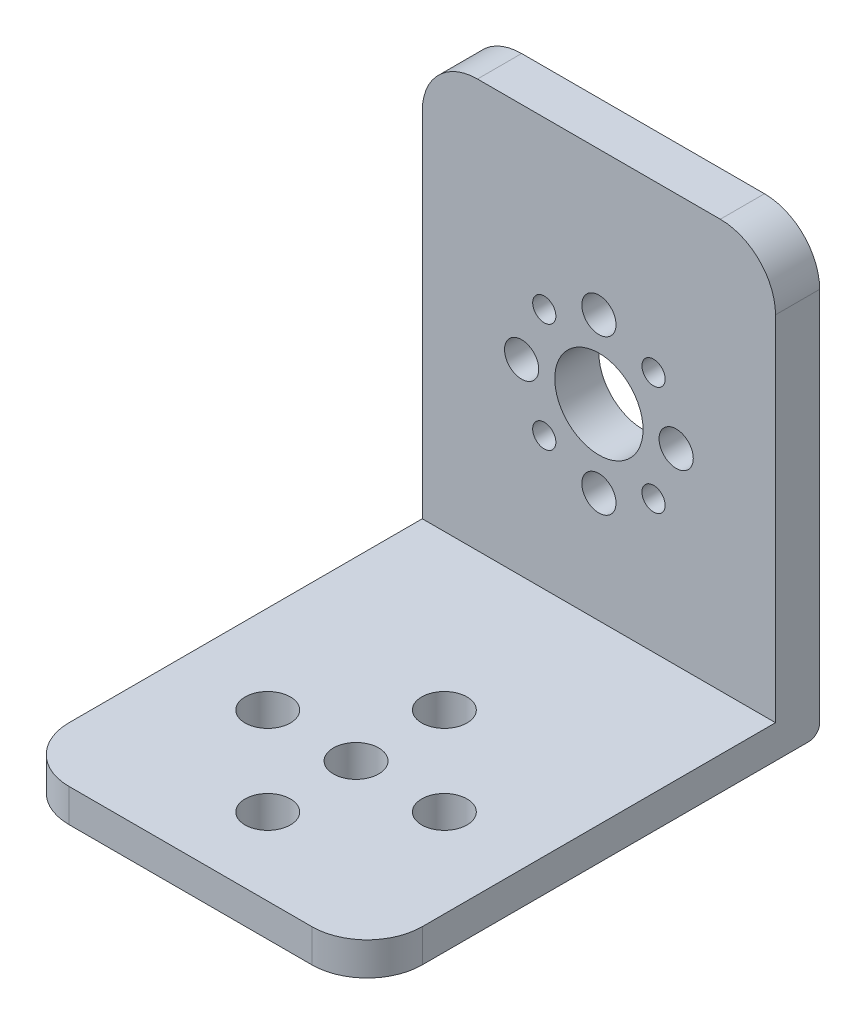
ISO-10303-21;
HEADER;
FILE_DESCRIPTION(('STEP AP214'),'2;1');
FILE_NAME('part.step','',(''),(''),'','','');
FILE_SCHEMA(('AUTOMOTIVE_DESIGN { 1 0 10303 214 1 1 1 1 }'));
ENDSEC;
DATA;
#1=APPLICATION_CONTEXT('core data for automotive mechanical design processes');
#2=APPLICATION_PROTOCOL_DEFINITION('international standard','automotive_design',2000,#1);
#3=PRODUCT_CONTEXT('',#1,'mechanical');
#4=PRODUCT('Part','Part','',(#3));
#5=PRODUCT_RELATED_PRODUCT_CATEGORY('part','',(#4));
#6=PRODUCT_DEFINITION_FORMATION('','',#4);
#7=PRODUCT_DEFINITION_CONTEXT('part definition',#1,'design');
#8=PRODUCT_DEFINITION('design','',#6,#7);
#9=PRODUCT_DEFINITION_SHAPE('','',#8);
#10=(LENGTH_UNIT() NAMED_UNIT(*) SI_UNIT(.MILLI.,.METRE.));
#11=(NAMED_UNIT(*) PLANE_ANGLE_UNIT() SI_UNIT($,.RADIAN.));
#12=(NAMED_UNIT(*) SI_UNIT($,.STERADIAN.) SOLID_ANGLE_UNIT());
#13=UNCERTAINTY_MEASURE_WITH_UNIT(LENGTH_MEASURE(1.E-05),#10,'distance_accuracy_value','');
#14=(GEOMETRIC_REPRESENTATION_CONTEXT(3) GLOBAL_UNCERTAINTY_ASSIGNED_CONTEXT((#13)) GLOBAL_UNIT_ASSIGNED_CONTEXT((#10,
#11,#12)) REPRESENTATION_CONTEXT('',''));
#15=CARTESIAN_POINT('',(0.,0.,0.));
#16=DIRECTION('',(0.,0.,1.));
#17=DIRECTION('',(1.,0.,0.));
#18=AXIS2_PLACEMENT_3D('',#15,#16,#17);
#19=CARTESIAN_POINT('',(16.,3.,-20.));
#20=DIRECTION('',(-1.,0.,0.));
#21=DIRECTION('',(0.,0.,1.));
#22=AXIS2_PLACEMENT_3D('',#19,#20,#21);
#23=PLANE('',#22);
#24=DIRECTION('',(0.,0.,-1.));
#25=VECTOR('',#24,1.);
#26=CARTESIAN_POINT('',(16.,0.,-20.));
#27=LINE('',#26,#25);
#28=CARTESIAN_POINT('',(16.,0.,15.));
#29=VERTEX_POINT('',#28);
#30=CARTESIAN_POINT('',(16.,0.,-20.));
#31=VERTEX_POINT('',#30);
#32=EDGE_CURVE('E258',#29,#31,#27,.T.);
#33=ORIENTED_EDGE('',*,*,#32,.T.);
#34=CARTESIAN_POINT('',(16.,1.,-20.));
#35=DIRECTION('',(-1.,0.,0.));
#36=DIRECTION('',(0.,0.,1.));
#37=AXIS2_PLACEMENT_3D('',#34,#35,#36);
#38=CIRCLE('',#37,1.);
#39=CARTESIAN_POINT('',(16.,1.,-21.));
#40=VERTEX_POINT('',#39);
#41=EDGE_CURVE('E11',#31,#40,#38,.F.);
#42=ORIENTED_EDGE('',*,*,#41,.T.);
#43=DIRECTION('',(0.,-1.,0.));
#44=VECTOR('',#43,1.);
#45=CARTESIAN_POINT('',(16.,35.,-21.));
#46=LINE('',#45,#44);
#47=CARTESIAN_POINT('',(16.,35.,-21.));
#48=VERTEX_POINT('',#47);
#49=EDGE_CURVE('E163',#48,#40,#46,.T.);
#50=ORIENTED_EDGE('',*,*,#49,.F.);
#51=DIRECTION('',(0.,0.,-1.));
#52=VECTOR('',#51,1.);
#53=CARTESIAN_POINT('',(16.,35.,-17.));
#54=LINE('',#53,#52);
#55=CARTESIAN_POINT('',(16.,35.,-17.));
#56=VERTEX_POINT('',#55);
#57=EDGE_CURVE('E284',#48,#56,#54,.F.);
#58=ORIENTED_EDGE('',*,*,#57,.T.);
#59=DIRECTION('',(0.,-1.,0.));
#60=VECTOR('',#59,1.);
#61=CARTESIAN_POINT('',(16.,40.,-17.));
#62=LINE('',#61,#60);
#63=CARTESIAN_POINT('',(16.,3.,-17.));
#64=VERTEX_POINT('',#63);
#65=EDGE_CURVE('E248',#56,#64,#62,.T.);
#66=ORIENTED_EDGE('',*,*,#65,.T.);
#67=DIRECTION('',(0.,0.,-1.));
#68=VECTOR('',#67,1.);
#69=CARTESIAN_POINT('',(16.,3.,-20.));
#70=LINE('',#69,#68);
#71=CARTESIAN_POINT('',(16.,3.,15.));
#72=VERTEX_POINT('',#71);
#73=EDGE_CURVE('E259',#72,#64,#70,.T.);
#74=ORIENTED_EDGE('',*,*,#73,.F.);
#75=DIRECTION('',(0.,-1.,0.));
#76=VECTOR('',#75,1.);
#77=CARTESIAN_POINT('',(16.,3.,15.));
#78=LINE('',#77,#76);
#79=EDGE_CURVE('E280',#72,#29,#78,.T.);
#80=ORIENTED_EDGE('',*,*,#79,.T.);
#81=EDGE_LOOP('',(#33,#42,#50,#58,#66,#74,#80));
#82=FACE_BOUND('',#81,.T.);
#83=ADVANCED_FACE('F39',(#82),#23,.F.);
#84=CARTESIAN_POINT('',(-16.,3.,-20.));
#85=DIRECTION('',(1.,0.,0.));
#86=DIRECTION('',(0.,0.,-1.));
#87=AXIS2_PLACEMENT_3D('',#84,#85,#86);
#88=PLANE('',#87);
#89=DIRECTION('',(0.,1.,0.));
#90=VECTOR('',#89,1.);
#91=CARTESIAN_POINT('',(-16.,0.,-21.));
#92=LINE('',#91,#90);
#93=CARTESIAN_POINT('',(-16.,1.,-21.));
#94=VERTEX_POINT('',#93);
#95=CARTESIAN_POINT('',(-16.,35.,-21.));
#96=VERTEX_POINT('',#95);
#97=EDGE_CURVE('E150',#94,#96,#92,.T.);
#98=ORIENTED_EDGE('',*,*,#97,.F.);
#99=CARTESIAN_POINT('',(-16.,1.,-20.));
#100=DIRECTION('',(1.,0.,0.));
#101=DIRECTION('',(0.,0.,-1.));
#102=AXIS2_PLACEMENT_3D('',#99,#100,#101);
#103=CIRCLE('',#102,1.);
#104=CARTESIAN_POINT('',(-16.,0.,-20.));
#105=VERTEX_POINT('',#104);
#106=EDGE_CURVE('E62',#94,#105,#103,.F.);
#107=ORIENTED_EDGE('',*,*,#106,.T.);
#108=DIRECTION('',(0.,0.,1.));
#109=VECTOR('',#108,1.);
#110=CARTESIAN_POINT('',(-16.,0.,-20.));
#111=LINE('',#110,#109);
#112=CARTESIAN_POINT('',(-16.,0.,15.));
#113=VERTEX_POINT('',#112);
#114=EDGE_CURVE('E272',#105,#113,#111,.T.);
#115=ORIENTED_EDGE('',*,*,#114,.T.);
#116=DIRECTION('',(0.,-1.,0.));
#117=VECTOR('',#116,1.);
#118=CARTESIAN_POINT('',(-16.,3.,15.));
#119=LINE('',#118,#117);
#120=CARTESIAN_POINT('',(-16.,3.,15.));
#121=VERTEX_POINT('',#120);
#122=EDGE_CURVE('E292',#113,#121,#119,.F.);
#123=ORIENTED_EDGE('',*,*,#122,.T.);
#124=DIRECTION('',(0.,0.,1.));
#125=VECTOR('',#124,1.);
#126=CARTESIAN_POINT('',(-16.,3.,-20.));
#127=LINE('',#126,#125);
#128=CARTESIAN_POINT('',(-16.,3.,-17.));
#129=VERTEX_POINT('',#128);
#130=EDGE_CURVE('E262',#129,#121,#127,.T.);
#131=ORIENTED_EDGE('',*,*,#130,.F.);
#132=DIRECTION('',(0.,-1.,0.));
#133=VECTOR('',#132,1.);
#134=CARTESIAN_POINT('',(-16.,40.,-17.));
#135=LINE('',#134,#133);
#136=CARTESIAN_POINT('',(-16.,35.,-17.));
#137=VERTEX_POINT('',#136);
#138=EDGE_CURVE('E255',#137,#129,#135,.T.);
#139=ORIENTED_EDGE('',*,*,#138,.F.);
#140=DIRECTION('',(0.,0.,1.));
#141=VECTOR('',#140,1.);
#142=CARTESIAN_POINT('',(-16.,35.,-20.));
#143=LINE('',#142,#141);
#144=EDGE_CURVE('E295',#137,#96,#143,.F.);
#145=ORIENTED_EDGE('',*,*,#144,.T.);
#146=EDGE_LOOP('',(#98,#107,#115,#123,#131,#139,#145));
#147=FACE_BOUND('',#146,.T.);
#148=ADVANCED_FACE('F327',(#147),#88,.F.);
#149=CARTESIAN_POINT('',(-16.,3.,20.));
#150=DIRECTION('',(0.,0.,-1.));
#151=DIRECTION('',(-1.,0.,0.));
#152=AXIS2_PLACEMENT_3D('',#149,#150,#151);
#153=PLANE('',#152);
#154=DIRECTION('',(1.,0.,0.));
#155=VECTOR('',#154,1.);
#156=CARTESIAN_POINT('',(-16.,3.,20.));
#157=LINE('',#156,#155);
#158=CARTESIAN_POINT('',(-11.,3.,20.));
#159=VERTEX_POINT('',#158);
#160=CARTESIAN_POINT('',(11.,3.,20.));
#161=VERTEX_POINT('',#160);
#162=EDGE_CURVE('E134',#159,#161,#157,.T.);
#163=ORIENTED_EDGE('',*,*,#162,.F.);
#164=DIRECTION('',(0.,-1.,0.));
#165=VECTOR('',#164,1.);
#166=CARTESIAN_POINT('',(-11.,3.,20.));
#167=LINE('',#166,#165);
#168=CARTESIAN_POINT('',(-11.,0.,20.));
#169=VERTEX_POINT('',#168);
#170=EDGE_CURVE('E301',#159,#169,#167,.T.);
#171=ORIENTED_EDGE('',*,*,#170,.T.);
#172=DIRECTION('',(1.,0.,0.));
#173=VECTOR('',#172,1.);
#174=CARTESIAN_POINT('',(-16.,0.,20.));
#175=LINE('',#174,#173);
#176=CARTESIAN_POINT('',(11.,0.,20.));
#177=VERTEX_POINT('',#176);
#178=EDGE_CURVE('E263',#169,#177,#175,.T.);
#179=ORIENTED_EDGE('',*,*,#178,.T.);
#180=DIRECTION('',(0.,-1.,0.));
#181=VECTOR('',#180,1.);
#182=CARTESIAN_POINT('',(11.,3.,20.));
#183=LINE('',#182,#181);
#184=EDGE_CURVE('E298',#177,#161,#183,.F.);
#185=ORIENTED_EDGE('',*,*,#184,.T.);
#186=EDGE_LOOP('',(#163,#171,#179,#185));
#187=FACE_BOUND('',#186,.T.);
#188=ADVANCED_FACE('F356',(#187),#153,.F.);
#189=CARTESIAN_POINT('',(0.,3.,0.));
#190=DIRECTION('',(0.,1.,0.));
#191=DIRECTION('',(0.,0.,1.));
#192=AXIS2_PLACEMENT_3D('',#189,#190,#191);
#193=PLANE('',#192);
#194=CARTESIAN_POINT('',(-8.,3.,5.00000000000001));
#195=DIRECTION('',(0.,1.,0.));
#196=DIRECTION('',(0.,0.,1.));
#197=AXIS2_PLACEMENT_3D('',#194,#195,#196);
#198=CIRCLE('',#197,2.05);
#199=CARTESIAN_POINT('',(-8.,3.,7.05000000000001));
#200=VERTEX_POINT('',#199);
#201=EDGE_CURVE('E190',#200,#200,#198,.T.);
#202=ORIENTED_EDGE('',*,*,#201,.F.);
#203=EDGE_LOOP('',(#202));
#204=FACE_BOUND('',#203,.T.);
#205=CARTESIAN_POINT('',(8.,3.,5.00000000000001));
#206=DIRECTION('',(0.,1.,0.));
#207=DIRECTION('',(0.,0.,1.));
#208=AXIS2_PLACEMENT_3D('',#205,#206,#207);
#209=CIRCLE('',#208,2.05);
#210=CARTESIAN_POINT('',(8.,3.,7.05000000000001));
#211=VERTEX_POINT('',#210);
#212=EDGE_CURVE('E173',#211,#211,#209,.T.);
#213=ORIENTED_EDGE('',*,*,#212,.F.);
#214=EDGE_LOOP('',(#213));
#215=FACE_BOUND('',#214,.T.);
#216=CARTESIAN_POINT('',(0.,3.,-2.99999999999999));
#217=DIRECTION('',(0.,1.,0.));
#218=DIRECTION('',(0.,0.,1.));
#219=AXIS2_PLACEMENT_3D('',#216,#217,#218);
#220=CIRCLE('',#219,2.05);
#221=CARTESIAN_POINT('',(0.,3.,-0.949999999999992));
#222=VERTEX_POINT('',#221);
#223=EDGE_CURVE('E174',#222,#222,#220,.T.);
#224=ORIENTED_EDGE('',*,*,#223,.F.);
#225=EDGE_LOOP('',(#224));
#226=FACE_BOUND('',#225,.T.);
#227=CARTESIAN_POINT('',(0.,3.,13.));
#228=DIRECTION('',(0.,1.,0.));
#229=DIRECTION('',(0.,0.,1.));
#230=AXIS2_PLACEMENT_3D('',#227,#228,#229);
#231=CIRCLE('',#230,2.05);
#232=CARTESIAN_POINT('',(0.,3.,15.05));
#233=VERTEX_POINT('',#232);
#234=EDGE_CURVE('E168',#233,#233,#231,.T.);
#235=ORIENTED_EDGE('',*,*,#234,.F.);
#236=EDGE_LOOP('',(#235));
#237=FACE_BOUND('',#236,.T.);
#238=CARTESIAN_POINT('',(0.,3.,5.00000000000001));
#239=DIRECTION('',(0.,1.,0.));
#240=DIRECTION('',(0.,0.,1.));
#241=AXIS2_PLACEMENT_3D('',#238,#239,#240);
#242=CIRCLE('',#241,2.05);
#243=CARTESIAN_POINT('',(0.,3.,7.05000000000001));
#244=VERTEX_POINT('',#243);
#245=EDGE_CURVE('E189',#244,#244,#242,.T.);
#246=ORIENTED_EDGE('',*,*,#245,.F.);
#247=EDGE_LOOP('',(#246));
#248=FACE_BOUND('',#247,.T.);
#249=ORIENTED_EDGE('',*,*,#130,.T.);
#250=CARTESIAN_POINT('',(-11.,3.,15.));
#251=DIRECTION('',(0.,1.,0.));
#252=DIRECTION('',(0.,0.,1.));
#253=AXIS2_PLACEMENT_3D('',#250,#251,#252);
#254=CIRCLE('',#253,5.);
#255=EDGE_CURVE('E315',#121,#159,#254,.T.);
#256=ORIENTED_EDGE('',*,*,#255,.T.);
#257=ORIENTED_EDGE('',*,*,#162,.T.);
#258=CARTESIAN_POINT('',(11.,3.,15.));
#259=DIRECTION('',(0.,1.,0.));
#260=DIRECTION('',(0.,0.,1.));
#261=AXIS2_PLACEMENT_3D('',#258,#259,#260);
#262=CIRCLE('',#261,5.);
#263=EDGE_CURVE('E312',#161,#72,#262,.T.);
#264=ORIENTED_EDGE('',*,*,#263,.T.);
#265=ORIENTED_EDGE('',*,*,#73,.T.);
#266=DIRECTION('',(1.,0.,0.));
#267=VECTOR('',#266,1.);
#268=CARTESIAN_POINT('',(-16.,3.,-17.));
#269=LINE('',#268,#267);
#270=EDGE_CURVE('E244',#129,#64,#269,.T.);
#271=ORIENTED_EDGE('',*,*,#270,.F.);
#272=EDGE_LOOP('',(#249,#256,#257,#264,#265,#271));
#273=FACE_BOUND('',#272,.T.);
#274=ADVANCED_FACE('F335',(#204,#215,#226,#237,#248,#273),#193,.T.);
#275=CARTESIAN_POINT('',(0.,0.,0.));
#276=DIRECTION('',(0.,1.,0.));
#277=DIRECTION('',(0.,0.,1.));
#278=AXIS2_PLACEMENT_3D('',#275,#276,#277);
#279=PLANE('',#278);
#280=CARTESIAN_POINT('',(-8.,0.,5.00000000000001));
#281=DIRECTION('',(0.,1.,0.));
#282=DIRECTION('',(0.,0.,1.));
#283=AXIS2_PLACEMENT_3D('',#280,#281,#282);
#284=CIRCLE('',#283,2.05);
#285=CARTESIAN_POINT('',(-8.,0.,7.05000000000001));
#286=VERTEX_POINT('',#285);
#287=EDGE_CURVE('E185',#286,#286,#284,.T.);
#288=ORIENTED_EDGE('',*,*,#287,.T.);
#289=EDGE_LOOP('',(#288));
#290=FACE_BOUND('',#289,.T.);
#291=CARTESIAN_POINT('',(8.,0.,5.00000000000001));
#292=DIRECTION('',(0.,1.,0.));
#293=DIRECTION('',(0.,0.,1.));
#294=AXIS2_PLACEMENT_3D('',#291,#292,#293);
#295=CIRCLE('',#294,2.05);
#296=CARTESIAN_POINT('',(8.,0.,7.05000000000001));
#297=VERTEX_POINT('',#296);
#298=EDGE_CURVE('E194',#297,#297,#295,.T.);
#299=ORIENTED_EDGE('',*,*,#298,.T.);
#300=EDGE_LOOP('',(#299));
#301=FACE_BOUND('',#300,.T.);
#302=CARTESIAN_POINT('',(0.,0.,-2.99999999999999));
#303=DIRECTION('',(0.,1.,0.));
#304=DIRECTION('',(0.,0.,1.));
#305=AXIS2_PLACEMENT_3D('',#302,#303,#304);
#306=CIRCLE('',#305,2.05);
#307=CARTESIAN_POINT('',(0.,0.,-0.949999999999992));
#308=VERTEX_POINT('',#307);
#309=EDGE_CURVE('E169',#308,#308,#306,.T.);
#310=ORIENTED_EDGE('',*,*,#309,.T.);
#311=EDGE_LOOP('',(#310));
#312=FACE_BOUND('',#311,.T.);
#313=CARTESIAN_POINT('',(0.,0.,13.));
#314=DIRECTION('',(0.,1.,0.));
#315=DIRECTION('',(0.,0.,1.));
#316=AXIS2_PLACEMENT_3D('',#313,#314,#315);
#317=CIRCLE('',#316,2.05);
#318=CARTESIAN_POINT('',(0.,0.,15.05));
#319=VERTEX_POINT('',#318);
#320=EDGE_CURVE('E178',#319,#319,#317,.T.);
#321=ORIENTED_EDGE('',*,*,#320,.T.);
#322=EDGE_LOOP('',(#321));
#323=FACE_BOUND('',#322,.T.);
#324=CARTESIAN_POINT('',(0.,0.,5.00000000000001));
#325=DIRECTION('',(0.,1.,0.));
#326=DIRECTION('',(0.,0.,1.));
#327=AXIS2_PLACEMENT_3D('',#324,#325,#326);
#328=CIRCLE('',#327,2.05);
#329=CARTESIAN_POINT('',(0.,0.,7.05000000000001));
#330=VERTEX_POINT('',#329);
#331=EDGE_CURVE('E201',#330,#330,#328,.T.);
#332=ORIENTED_EDGE('',*,*,#331,.T.);
#333=EDGE_LOOP('',(#332));
#334=FACE_BOUND('',#333,.T.);
#335=ORIENTED_EDGE('',*,*,#114,.F.);
#336=DIRECTION('',(-1.,0.,0.));
#337=VECTOR('',#336,1.);
#338=CARTESIAN_POINT('',(16.,0.,-20.));
#339=LINE('',#338,#337);
#340=EDGE_CURVE('E48',#105,#31,#339,.F.);
#341=ORIENTED_EDGE('',*,*,#340,.T.);
#342=ORIENTED_EDGE('',*,*,#32,.F.);
#343=CARTESIAN_POINT('',(11.,0.,15.));
#344=DIRECTION('',(0.,1.,0.));
#345=DIRECTION('',(0.,0.,1.));
#346=AXIS2_PLACEMENT_3D('',#343,#344,#345);
#347=CIRCLE('',#346,5.);
#348=EDGE_CURVE('E305',#29,#177,#347,.F.);
#349=ORIENTED_EDGE('',*,*,#348,.T.);
#350=ORIENTED_EDGE('',*,*,#178,.F.);
#351=CARTESIAN_POINT('',(-11.,0.,15.));
#352=DIRECTION('',(0.,1.,0.));
#353=DIRECTION('',(0.,0.,1.));
#354=AXIS2_PLACEMENT_3D('',#351,#352,#353);
#355=CIRCLE('',#354,5.);
#356=EDGE_CURVE('E308',#169,#113,#355,.F.);
#357=ORIENTED_EDGE('',*,*,#356,.T.);
#358=EDGE_LOOP('',(#335,#341,#342,#349,#350,#357));
#359=FACE_BOUND('',#358,.T.);
#360=ADVANCED_FACE('F373',(#290,#301,#312,#323,#334,#359),#279,.F.);
#361=CARTESIAN_POINT('',(-16.,40.,-17.));
#362=DIRECTION('',(0.,0.,-1.));
#363=DIRECTION('',(-1.,0.,0.));
#364=AXIS2_PLACEMENT_3D('',#361,#362,#363);
#365=PLANE('',#364);
#366=CARTESIAN_POINT('',(7.,20.,-17.));
#367=DIRECTION('',(0.,0.,1.));
#368=DIRECTION('',(1.,0.,0.));
#369=AXIS2_PLACEMENT_3D('',#366,#367,#368);
#370=CIRCLE('',#369,1.55);
#371=CARTESIAN_POINT('',(8.55,20.,-17.));
#372=VERTEX_POINT('',#371);
#373=EDGE_CURVE('E225',#372,#372,#370,.T.);
#374=ORIENTED_EDGE('',*,*,#373,.F.);
#375=EDGE_LOOP('',(#374));
#376=FACE_BOUND('',#375,.T.);
#377=CARTESIAN_POINT('',(4.94974746830582,24.9497474683058,-17.));
#378=DIRECTION('',(0.,0.,1.));
#379=DIRECTION('',(1.,0.,0.));
#380=AXIS2_PLACEMENT_3D('',#377,#378,#379);
#381=CIRCLE('',#380,1.05);
#382=CARTESIAN_POINT('',(5.99974746830582,24.9497474683058,-17.));
#383=VERTEX_POINT('',#382);
#384=EDGE_CURVE('E230',#383,#383,#381,.T.);
#385=ORIENTED_EDGE('',*,*,#384,.F.);
#386=EDGE_LOOP('',(#385));
#387=FACE_BOUND('',#386,.T.);
#388=CARTESIAN_POINT('',(0.,13.,-17.));
#389=DIRECTION('',(0.,0.,1.));
#390=DIRECTION('',(1.,0.,0.));
#391=AXIS2_PLACEMENT_3D('',#388,#389,#390);
#392=CIRCLE('',#391,1.55);
#393=CARTESIAN_POINT('',(1.54999999999997,13.,-17.));
#394=VERTEX_POINT('',#393);
#395=EDGE_CURVE('E234',#394,#394,#392,.T.);
#396=ORIENTED_EDGE('',*,*,#395,.F.);
#397=EDGE_LOOP('',(#396));
#398=FACE_BOUND('',#397,.T.);
#399=CARTESIAN_POINT('',(-7.,20.,-17.));
#400=DIRECTION('',(0.,0.,1.));
#401=DIRECTION('',(1.,0.,0.));
#402=AXIS2_PLACEMENT_3D('',#399,#400,#401);
#403=CIRCLE('',#402,1.55);
#404=CARTESIAN_POINT('',(-5.45,20.,-17.));
#405=VERTEX_POINT('',#404);
#406=EDGE_CURVE('E213',#405,#405,#403,.T.);
#407=ORIENTED_EDGE('',*,*,#406,.F.);
#408=EDGE_LOOP('',(#407));
#409=FACE_BOUND('',#408,.T.);
#410=CARTESIAN_POINT('',(0.,27.,-17.));
#411=DIRECTION('',(0.,0.,1.));
#412=DIRECTION('',(1.,0.,0.));
#413=AXIS2_PLACEMENT_3D('',#410,#411,#412);
#414=CIRCLE('',#413,1.55);
#415=CARTESIAN_POINT('',(1.55000000000007,27.,-17.));
#416=VERTEX_POINT('',#415);
#417=EDGE_CURVE('E209',#416,#416,#414,.T.);
#418=ORIENTED_EDGE('',*,*,#417,.F.);
#419=EDGE_LOOP('',(#418));
#420=FACE_BOUND('',#419,.T.);
#421=CARTESIAN_POINT('',(4.94974746830596,15.0502525316942,-17.));
#422=DIRECTION('',(0.,0.,1.));
#423=DIRECTION('',(1.,0.,0.));
#424=AXIS2_PLACEMENT_3D('',#421,#422,#423);
#425=CIRCLE('',#424,1.05);
#426=CARTESIAN_POINT('',(5.99974746830596,15.0502525316942,-17.));
#427=VERTEX_POINT('',#426);
#428=EDGE_CURVE('E214',#427,#427,#425,.T.);
#429=ORIENTED_EDGE('',*,*,#428,.F.);
#430=EDGE_LOOP('',(#429));
#431=FACE_BOUND('',#430,.T.);
#432=CARTESIAN_POINT('',(-4.94974746830572,15.0502525316941,-17.));
#433=DIRECTION('',(0.,0.,1.));
#434=DIRECTION('',(1.,0.,0.));
#435=AXIS2_PLACEMENT_3D('',#432,#433,#434);
#436=CIRCLE('',#435,1.05);
#437=CARTESIAN_POINT('',(-3.89974746830572,15.0502525316941,-17.));
#438=VERTEX_POINT('',#437);
#439=EDGE_CURVE('E218',#438,#438,#436,.T.);
#440=ORIENTED_EDGE('',*,*,#439,.F.);
#441=EDGE_LOOP('',(#440));
#442=FACE_BOUND('',#441,.T.);
#443=CARTESIAN_POINT('',(-4.94974746830579,24.9497474683057,-17.));
#444=DIRECTION('',(0.,0.,1.));
#445=DIRECTION('',(1.,0.,0.));
#446=AXIS2_PLACEMENT_3D('',#443,#444,#445);
#447=CIRCLE('',#446,1.05);
#448=CARTESIAN_POINT('',(-3.89974746830579,24.9497474683057,-17.));
#449=VERTEX_POINT('',#448);
#450=EDGE_CURVE('E205',#449,#449,#447,.T.);
#451=ORIENTED_EDGE('',*,*,#450,.F.);
#452=EDGE_LOOP('',(#451));
#453=FACE_BOUND('',#452,.T.);
#454=CARTESIAN_POINT('',(0.,20.,-17.));
#455=DIRECTION('',(0.,0.,1.));
#456=DIRECTION('',(1.,0.,0.));
#457=AXIS2_PLACEMENT_3D('',#454,#455,#456);
#458=CIRCLE('',#457,4.);
#459=CARTESIAN_POINT('',(4.,20.,-17.));
#460=VERTEX_POINT('',#459);
#461=EDGE_CURVE('E229',#460,#460,#458,.T.);
#462=ORIENTED_EDGE('',*,*,#461,.F.);
#463=EDGE_LOOP('',(#462));
#464=FACE_BOUND('',#463,.T.);
#465=ORIENTED_EDGE('',*,*,#65,.F.);
#466=CARTESIAN_POINT('',(11.,35.,-17.));
#467=DIRECTION('',(0.,0.,-1.));
#468=DIRECTION('',(-1.,0.,0.));
#469=AXIS2_PLACEMENT_3D('',#466,#467,#468);
#470=CIRCLE('',#469,5.);
#471=CARTESIAN_POINT('',(11.,40.,-17.));
#472=VERTEX_POINT('',#471);
#473=EDGE_CURVE('E289',#56,#472,#470,.F.);
#474=ORIENTED_EDGE('',*,*,#473,.T.);
#475=DIRECTION('',(1.,0.,0.));
#476=VECTOR('',#475,1.);
#477=CARTESIAN_POINT('',(-16.,40.,-17.));
#478=LINE('',#477,#476);
#479=CARTESIAN_POINT('',(-11.,40.,-17.));
#480=VERTEX_POINT('',#479);
#481=EDGE_CURVE('E245',#480,#472,#478,.T.);
#482=ORIENTED_EDGE('',*,*,#481,.F.);
#483=CARTESIAN_POINT('',(-11.,35.,-17.));
#484=DIRECTION('',(0.,0.,-1.));
#485=DIRECTION('',(-1.,0.,0.));
#486=AXIS2_PLACEMENT_3D('',#483,#484,#485);
#487=CIRCLE('',#486,5.);
#488=EDGE_CURVE('E128',#480,#137,#487,.F.);
#489=ORIENTED_EDGE('',*,*,#488,.T.);
#490=ORIENTED_EDGE('',*,*,#138,.T.);
#491=ORIENTED_EDGE('',*,*,#270,.T.);
#492=EDGE_LOOP('',(#465,#474,#482,#489,#490,#491));
#493=FACE_BOUND('',#492,.T.);
#494=ADVANCED_FACE('F333',(#376,#387,#398,#409,#420,#431,#442,#453,#464,#493),#365,.F.);
#495=CARTESIAN_POINT('',(0.,40.,0.));
#496=DIRECTION('',(0.,1.,0.));
#497=DIRECTION('',(0.,0.,1.));
#498=AXIS2_PLACEMENT_3D('',#495,#496,#497);
#499=PLANE('',#498);
#500=ORIENTED_EDGE('',*,*,#481,.T.);
#501=DIRECTION('',(0.,0.,-1.));
#502=VECTOR('',#501,1.);
#503=CARTESIAN_POINT('',(11.,40.,-20.));
#504=LINE('',#503,#502);
#505=CARTESIAN_POINT('',(11.,40.,-21.));
#506=VERTEX_POINT('',#505);
#507=EDGE_CURVE('E133',#472,#506,#504,.T.);
#508=ORIENTED_EDGE('',*,*,#507,.T.);
#509=DIRECTION('',(1.,0.,0.));
#510=VECTOR('',#509,1.);
#511=CARTESIAN_POINT('',(-11.,40.,-21.));
#512=LINE('',#511,#510);
#513=CARTESIAN_POINT('',(-11.,40.,-21.));
#514=VERTEX_POINT('',#513);
#515=EDGE_CURVE('E137',#514,#506,#512,.T.);
#516=ORIENTED_EDGE('',*,*,#515,.F.);
#517=DIRECTION('',(0.,0.,1.));
#518=VECTOR('',#517,1.);
#519=CARTESIAN_POINT('',(-11.,40.,-17.));
#520=LINE('',#519,#518);
#521=EDGE_CURVE('E122',#514,#480,#520,.T.);
#522=ORIENTED_EDGE('',*,*,#521,.T.);
#523=EDGE_LOOP('',(#500,#508,#516,#522));
#524=FACE_BOUND('',#523,.T.);
#525=ADVANCED_FACE('F138',(#524),#499,.T.);
#526=CARTESIAN_POINT('',(0.,20.,-20.));
#527=DIRECTION('',(0.,0.,1.));
#528=DIRECTION('',(1.,0.,0.));
#529=AXIS2_PLACEMENT_3D('',#526,#527,#528);
#530=CYLINDRICAL_SURFACE('',#529,4.);
#531=ORIENTED_EDGE('',*,*,#461,.T.);
#532=EDGE_LOOP('',(#531));
#533=FACE_BOUND('',#532,.T.);
#534=CARTESIAN_POINT('',(0.,20.,-21.));
#535=DIRECTION('',(0.,0.,-1.));
#536=DIRECTION('',(-1.,0.,0.));
#537=AXIS2_PLACEMENT_3D('',#534,#535,#536);
#538=CIRCLE('',#537,4.);
#539=CARTESIAN_POINT('',(-4.,20.,-21.));
#540=VERTEX_POINT('',#539);
#541=EDGE_CURVE('E701',#540,#540,#538,.T.);
#542=ORIENTED_EDGE('',*,*,#541,.T.);
#543=EDGE_LOOP('',(#542));
#544=FACE_BOUND('',#543,.T.);
#545=ADVANCED_FACE('F394',(#533,#544),#530,.F.);
#546=CARTESIAN_POINT('',(-4.94974746830579,24.9497474683057,-20.));
#547=DIRECTION('',(0.,0.,1.));
#548=DIRECTION('',(1.,0.,0.));
#549=AXIS2_PLACEMENT_3D('',#546,#547,#548);
#550=CYLINDRICAL_SURFACE('',#549,1.05);
#551=ORIENTED_EDGE('',*,*,#450,.T.);
#552=EDGE_LOOP('',(#551));
#553=FACE_BOUND('',#552,.T.);
#554=CARTESIAN_POINT('',(-4.94974746830579,24.9497474683057,-21.));
#555=DIRECTION('',(0.,0.,-1.));
#556=DIRECTION('',(-1.,0.,0.));
#557=AXIS2_PLACEMENT_3D('',#554,#555,#556);
#558=CIRCLE('',#557,1.05);
#559=CARTESIAN_POINT('',(-5.99974746830579,24.9497474683057,-21.));
#560=VERTEX_POINT('',#559);
#561=EDGE_CURVE('E687',#560,#560,#558,.T.);
#562=ORIENTED_EDGE('',*,*,#561,.T.);
#563=EDGE_LOOP('',(#562));
#564=FACE_BOUND('',#563,.T.);
#565=ADVANCED_FACE('F397',(#553,#564),#550,.F.);
#566=CARTESIAN_POINT('',(-4.94974746830572,15.0502525316941,-20.));
#567=DIRECTION('',(0.,0.,1.));
#568=DIRECTION('',(1.,0.,0.));
#569=AXIS2_PLACEMENT_3D('',#566,#567,#568);
#570=CYLINDRICAL_SURFACE('',#569,1.05);
#571=ORIENTED_EDGE('',*,*,#439,.T.);
#572=EDGE_LOOP('',(#571));
#573=FACE_BOUND('',#572,.T.);
#574=CARTESIAN_POINT('',(-4.94974746830572,15.0502525316941,-21.));
#575=DIRECTION('',(0.,0.,-1.));
#576=DIRECTION('',(-1.,0.,0.));
#577=AXIS2_PLACEMENT_3D('',#574,#575,#576);
#578=CIRCLE('',#577,1.05);
#579=CARTESIAN_POINT('',(-5.99974746830572,15.0502525316941,-21.));
#580=VERTEX_POINT('',#579);
#581=EDGE_CURVE('E697',#580,#580,#578,.T.);
#582=ORIENTED_EDGE('',*,*,#581,.T.);
#583=EDGE_LOOP('',(#582));
#584=FACE_BOUND('',#583,.T.);
#585=ADVANCED_FACE('F419',(#573,#584),#570,.F.);
#586=CARTESIAN_POINT('',(4.94974746830596,15.0502525316942,-20.));
#587=DIRECTION('',(0.,0.,1.));
#588=DIRECTION('',(1.,0.,0.));
#589=AXIS2_PLACEMENT_3D('',#586,#587,#588);
#590=CYLINDRICAL_SURFACE('',#589,1.05);
#591=ORIENTED_EDGE('',*,*,#428,.T.);
#592=EDGE_LOOP('',(#591));
#593=FACE_BOUND('',#592,.T.);
#594=CARTESIAN_POINT('',(4.94974746830596,15.0502525316942,-21.));
#595=DIRECTION('',(0.,0.,-1.));
#596=DIRECTION('',(-1.,0.,0.));
#597=AXIS2_PLACEMENT_3D('',#594,#595,#596);
#598=CIRCLE('',#597,1.05);
#599=CARTESIAN_POINT('',(3.89974746830596,15.0502525316942,-21.));
#600=VERTEX_POINT('',#599);
#601=EDGE_CURVE('E157',#600,#600,#598,.T.);
#602=ORIENTED_EDGE('',*,*,#601,.T.);
#603=EDGE_LOOP('',(#602));
#604=FACE_BOUND('',#603,.T.);
#605=ADVANCED_FACE('F423',(#593,#604),#590,.F.);
#606=CARTESIAN_POINT('',(0.,27.,-20.));
#607=DIRECTION('',(0.,0.,1.));
#608=DIRECTION('',(1.,0.,0.));
#609=AXIS2_PLACEMENT_3D('',#606,#607,#608);
#610=CYLINDRICAL_SURFACE('',#609,1.55);
#611=ORIENTED_EDGE('',*,*,#417,.T.);
#612=EDGE_LOOP('',(#611));
#613=FACE_BOUND('',#612,.T.);
#614=CARTESIAN_POINT('',(0.,27.,-21.));
#615=DIRECTION('',(0.,0.,-1.));
#616=DIRECTION('',(-1.,0.,0.));
#617=AXIS2_PLACEMENT_3D('',#614,#615,#616);
#618=CIRCLE('',#617,1.55);
#619=CARTESIAN_POINT('',(-1.54999999999993,27.,-21.));
#620=VERTEX_POINT('',#619);
#621=EDGE_CURVE('E680',#620,#620,#618,.T.);
#622=ORIENTED_EDGE('',*,*,#621,.T.);
#623=EDGE_LOOP('',(#622));
#624=FACE_BOUND('',#623,.T.);
#625=ADVANCED_FACE('F403',(#613,#624),#610,.F.);
#626=CARTESIAN_POINT('',(-7.,20.,-20.));
#627=DIRECTION('',(0.,0.,1.));
#628=DIRECTION('',(1.,0.,0.));
#629=AXIS2_PLACEMENT_3D('',#626,#627,#628);
#630=CYLINDRICAL_SURFACE('',#629,1.55);
#631=ORIENTED_EDGE('',*,*,#406,.T.);
#632=EDGE_LOOP('',(#631));
#633=FACE_BOUND('',#632,.T.);
#634=CARTESIAN_POINT('',(-7.,20.,-21.));
#635=DIRECTION('',(0.,0.,-1.));
#636=DIRECTION('',(-1.,0.,0.));
#637=AXIS2_PLACEMENT_3D('',#634,#635,#636);
#638=CIRCLE('',#637,1.55);
#639=CARTESIAN_POINT('',(-8.55,20.,-21.));
#640=VERTEX_POINT('',#639);
#641=EDGE_CURVE('E693',#640,#640,#638,.T.);
#642=ORIENTED_EDGE('',*,*,#641,.T.);
#643=EDGE_LOOP('',(#642));
#644=FACE_BOUND('',#643,.T.);
#645=ADVANCED_FACE('F399',(#633,#644),#630,.F.);
#646=CARTESIAN_POINT('',(0.,13.,-20.));
#647=DIRECTION('',(0.,0.,1.));
#648=DIRECTION('',(1.,0.,0.));
#649=AXIS2_PLACEMENT_3D('',#646,#647,#648);
#650=CYLINDRICAL_SURFACE('',#649,1.55);
#651=ORIENTED_EDGE('',*,*,#395,.T.);
#652=EDGE_LOOP('',(#651));
#653=FACE_BOUND('',#652,.T.);
#654=CARTESIAN_POINT('',(0.,13.,-21.));
#655=DIRECTION('',(0.,0.,-1.));
#656=DIRECTION('',(-1.,0.,0.));
#657=AXIS2_PLACEMENT_3D('',#654,#655,#656);
#658=CIRCLE('',#657,1.55);
#659=CARTESIAN_POINT('',(-1.55000000000003,13.,-21.));
#660=VERTEX_POINT('',#659);
#661=EDGE_CURVE('E705',#660,#660,#658,.T.);
#662=ORIENTED_EDGE('',*,*,#661,.T.);
#663=EDGE_LOOP('',(#662));
#664=FACE_BOUND('',#663,.T.);
#665=ADVANCED_FACE('F402',(#653,#664),#650,.F.);
#666=CARTESIAN_POINT('',(4.94974746830582,24.9497474683058,-20.));
#667=DIRECTION('',(0.,0.,1.));
#668=DIRECTION('',(1.,0.,0.));
#669=AXIS2_PLACEMENT_3D('',#666,#667,#668);
#670=CYLINDRICAL_SURFACE('',#669,1.05);
#671=ORIENTED_EDGE('',*,*,#384,.T.);
#672=EDGE_LOOP('',(#671));
#673=FACE_BOUND('',#672,.T.);
#674=CARTESIAN_POINT('',(4.94974746830582,24.9497474683058,-21.));
#675=DIRECTION('',(0.,0.,-1.));
#676=DIRECTION('',(-1.,0.,0.));
#677=AXIS2_PLACEMENT_3D('',#674,#675,#676);
#678=CIRCLE('',#677,1.05);
#679=CARTESIAN_POINT('',(3.89974746830582,24.9497474683058,-21.));
#680=VERTEX_POINT('',#679);
#681=EDGE_CURVE('E683',#680,#680,#678,.T.);
#682=ORIENTED_EDGE('',*,*,#681,.T.);
#683=EDGE_LOOP('',(#682));
#684=FACE_BOUND('',#683,.T.);
#685=ADVANCED_FACE('F407',(#673,#684),#670,.F.);
#686=CARTESIAN_POINT('',(7.,20.,-20.));
#687=DIRECTION('',(0.,0.,1.));
#688=DIRECTION('',(1.,0.,0.));
#689=AXIS2_PLACEMENT_3D('',#686,#687,#688);
#690=CYLINDRICAL_SURFACE('',#689,1.55);
#691=ORIENTED_EDGE('',*,*,#373,.T.);
#692=EDGE_LOOP('',(#691));
#693=FACE_BOUND('',#692,.T.);
#694=CARTESIAN_POINT('',(7.,20.,-21.));
#695=DIRECTION('',(0.,0.,-1.));
#696=DIRECTION('',(-1.,0.,0.));
#697=AXIS2_PLACEMENT_3D('',#694,#695,#696);
#698=CIRCLE('',#697,1.55);
#699=CARTESIAN_POINT('',(5.45,20.,-21.));
#700=VERTEX_POINT('',#699);
#701=EDGE_CURVE('E153',#700,#700,#698,.T.);
#702=ORIENTED_EDGE('',*,*,#701,.T.);
#703=EDGE_LOOP('',(#702));
#704=FACE_BOUND('',#703,.T.);
#705=ADVANCED_FACE('F411',(#693,#704),#690,.F.);
#706=CARTESIAN_POINT('',(0.,0.,5.00000000000001));
#707=DIRECTION('',(0.,1.,0.));
#708=DIRECTION('',(0.,0.,1.));
#709=AXIS2_PLACEMENT_3D('',#706,#707,#708);
#710=CYLINDRICAL_SURFACE('',#709,2.05);
#711=ORIENTED_EDGE('',*,*,#331,.F.);
#712=EDGE_LOOP('',(#711));
#713=FACE_BOUND('',#712,.T.);
#714=ORIENTED_EDGE('',*,*,#245,.T.);
#715=EDGE_LOOP('',(#714));
#716=FACE_BOUND('',#715,.T.);
#717=ADVANCED_FACE('F415',(#713,#716),#710,.F.);
#718=CARTESIAN_POINT('',(0.,0.,13.));
#719=DIRECTION('',(0.,1.,0.));
#720=DIRECTION('',(0.,0.,1.));
#721=AXIS2_PLACEMENT_3D('',#718,#719,#720);
#722=CYLINDRICAL_SURFACE('',#721,2.05);
#723=ORIENTED_EDGE('',*,*,#320,.F.);
#724=EDGE_LOOP('',(#723));
#725=FACE_BOUND('',#724,.T.);
#726=ORIENTED_EDGE('',*,*,#234,.T.);
#727=EDGE_LOOP('',(#726));
#728=FACE_BOUND('',#727,.T.);
#729=ADVANCED_FACE('F433',(#725,#728),#722,.F.);
#730=CARTESIAN_POINT('',(0.,0.,-2.99999999999999));
#731=DIRECTION('',(0.,1.,0.));
#732=DIRECTION('',(0.,0.,1.));
#733=AXIS2_PLACEMENT_3D('',#730,#731,#732);
#734=CYLINDRICAL_SURFACE('',#733,2.05);
#735=ORIENTED_EDGE('',*,*,#309,.F.);
#736=EDGE_LOOP('',(#735));
#737=FACE_BOUND('',#736,.T.);
#738=ORIENTED_EDGE('',*,*,#223,.T.);
#739=EDGE_LOOP('',(#738));
#740=FACE_BOUND('',#739,.T.);
#741=ADVANCED_FACE('F438',(#737,#740),#734,.F.);
#742=CARTESIAN_POINT('',(8.,0.,5.00000000000001));
#743=DIRECTION('',(0.,1.,0.));
#744=DIRECTION('',(0.,0.,1.));
#745=AXIS2_PLACEMENT_3D('',#742,#743,#744);
#746=CYLINDRICAL_SURFACE('',#745,2.05);
#747=ORIENTED_EDGE('',*,*,#298,.F.);
#748=EDGE_LOOP('',(#747));
#749=FACE_BOUND('',#748,.T.);
#750=ORIENTED_EDGE('',*,*,#212,.T.);
#751=EDGE_LOOP('',(#750));
#752=FACE_BOUND('',#751,.T.);
#753=ADVANCED_FACE('F435',(#749,#752),#746,.F.);
#754=CARTESIAN_POINT('',(-8.,0.,5.00000000000001));
#755=DIRECTION('',(0.,1.,0.));
#756=DIRECTION('',(0.,0.,1.));
#757=AXIS2_PLACEMENT_3D('',#754,#755,#756);
#758=CYLINDRICAL_SURFACE('',#757,2.05);
#759=ORIENTED_EDGE('',*,*,#287,.F.);
#760=EDGE_LOOP('',(#759));
#761=FACE_BOUND('',#760,.T.);
#762=ORIENTED_EDGE('',*,*,#201,.T.);
#763=EDGE_LOOP('',(#762));
#764=FACE_BOUND('',#763,.T.);
#765=ADVANCED_FACE('F362',(#761,#764),#758,.F.);
#766=CARTESIAN_POINT('',(11.,35.,0.));
#767=DIRECTION('',(0.,0.,1.));
#768=DIRECTION('',(1.,0.,0.));
#769=AXIS2_PLACEMENT_3D('',#766,#767,#768);
#770=CYLINDRICAL_SURFACE('',#769,5.);
#771=ORIENTED_EDGE('',*,*,#473,.F.);
#772=ORIENTED_EDGE('',*,*,#57,.F.);
#773=CARTESIAN_POINT('',(11.,35.,-21.));
#774=DIRECTION('',(0.,0.,-1.));
#775=DIRECTION('',(-1.,0.,0.));
#776=AXIS2_PLACEMENT_3D('',#773,#774,#775);
#777=CIRCLE('',#776,5.);
#778=EDGE_CURVE('E144',#506,#48,#777,.T.);
#779=ORIENTED_EDGE('',*,*,#778,.F.);
#780=ORIENTED_EDGE('',*,*,#507,.F.);
#781=EDGE_LOOP('',(#771,#772,#779,#780));
#782=FACE_BOUND('',#781,.T.);
#783=ADVANCED_FACE('F343',(#782),#770,.T.);
#784=CARTESIAN_POINT('',(-11.,35.,0.));
#785=DIRECTION('',(0.,0.,-1.));
#786=DIRECTION('',(-1.,0.,0.));
#787=AXIS2_PLACEMENT_3D('',#784,#785,#786);
#788=CYLINDRICAL_SURFACE('',#787,5.);
#789=ORIENTED_EDGE('',*,*,#521,.F.);
#790=CARTESIAN_POINT('',(-11.,35.,-21.));
#791=DIRECTION('',(0.,0.,-1.));
#792=DIRECTION('',(-1.,0.,0.));
#793=AXIS2_PLACEMENT_3D('',#790,#791,#792);
#794=CIRCLE('',#793,5.);
#795=EDGE_CURVE('E127',#96,#514,#794,.T.);
#796=ORIENTED_EDGE('',*,*,#795,.F.);
#797=ORIENTED_EDGE('',*,*,#144,.F.);
#798=ORIENTED_EDGE('',*,*,#488,.F.);
#799=EDGE_LOOP('',(#789,#796,#797,#798));
#800=FACE_BOUND('',#799,.T.);
#801=ADVANCED_FACE('F124',(#800),#788,.T.);
#802=CARTESIAN_POINT('',(-11.,3.,15.));
#803=DIRECTION('',(0.,-1.,0.));
#804=DIRECTION('',(0.,0.,-1.));
#805=AXIS2_PLACEMENT_3D('',#802,#803,#804);
#806=CYLINDRICAL_SURFACE('',#805,5.);
#807=ORIENTED_EDGE('',*,*,#255,.F.);
#808=ORIENTED_EDGE('',*,*,#122,.F.);
#809=ORIENTED_EDGE('',*,*,#356,.F.);
#810=ORIENTED_EDGE('',*,*,#170,.F.);
#811=EDGE_LOOP('',(#807,#808,#809,#810));
#812=FACE_BOUND('',#811,.T.);
#813=ADVANCED_FACE('F365',(#812),#806,.T.);
#814=CARTESIAN_POINT('',(11.,3.,15.));
#815=DIRECTION('',(0.,-1.,0.));
#816=DIRECTION('',(0.,0.,-1.));
#817=AXIS2_PLACEMENT_3D('',#814,#815,#816);
#818=CYLINDRICAL_SURFACE('',#817,5.);
#819=ORIENTED_EDGE('',*,*,#263,.F.);
#820=ORIENTED_EDGE('',*,*,#184,.F.);
#821=ORIENTED_EDGE('',*,*,#348,.F.);
#822=ORIENTED_EDGE('',*,*,#79,.F.);
#823=EDGE_LOOP('',(#819,#820,#821,#822));
#824=FACE_BOUND('',#823,.T.);
#825=ADVANCED_FACE('F348',(#824),#818,.T.);
#826=CARTESIAN_POINT('',(-11.,35.,-21.));
#827=DIRECTION('',(0.,0.,-1.));
#828=DIRECTION('',(-1.,0.,0.));
#829=AXIS2_PLACEMENT_3D('',#826,#827,#828);
#830=PLANE('',#829);
#831=ORIENTED_EDGE('',*,*,#681,.F.);
#832=EDGE_LOOP('',(#831));
#833=FACE_BOUND('',#832,.T.);
#834=ORIENTED_EDGE('',*,*,#641,.F.);
#835=EDGE_LOOP('',(#834));
#836=FACE_BOUND('',#835,.T.);
#837=ORIENTED_EDGE('',*,*,#541,.F.);
#838=EDGE_LOOP('',(#837));
#839=FACE_BOUND('',#838,.T.);
#840=ORIENTED_EDGE('',*,*,#601,.F.);
#841=EDGE_LOOP('',(#840));
#842=FACE_BOUND('',#841,.T.);
#843=ORIENTED_EDGE('',*,*,#49,.T.);
#844=DIRECTION('',(-1.,0.,0.));
#845=VECTOR('',#844,1.);
#846=CARTESIAN_POINT('',(-16.,1.,-21.));
#847=LINE('',#846,#845);
#848=EDGE_CURVE('E318',#40,#94,#847,.T.);
#849=ORIENTED_EDGE('',*,*,#848,.T.);
#850=ORIENTED_EDGE('',*,*,#97,.T.);
#851=ORIENTED_EDGE('',*,*,#795,.T.);
#852=ORIENTED_EDGE('',*,*,#515,.T.);
#853=ORIENTED_EDGE('',*,*,#778,.T.);
#854=EDGE_LOOP('',(#843,#849,#850,#851,#852,#853));
#855=FACE_BOUND('',#854,.T.);
#856=ORIENTED_EDGE('',*,*,#701,.F.);
#857=EDGE_LOOP('',(#856));
#858=FACE_BOUND('',#857,.T.);
#859=ORIENTED_EDGE('',*,*,#661,.F.);
#860=EDGE_LOOP('',(#859));
#861=FACE_BOUND('',#860,.T.);
#862=ORIENTED_EDGE('',*,*,#581,.F.);
#863=EDGE_LOOP('',(#862));
#864=FACE_BOUND('',#863,.T.);
#865=ORIENTED_EDGE('',*,*,#561,.F.);
#866=EDGE_LOOP('',(#865));
#867=FACE_BOUND('',#866,.T.);
#868=ORIENTED_EDGE('',*,*,#621,.F.);
#869=EDGE_LOOP('',(#868));
#870=FACE_BOUND('',#869,.T.);
#871=ADVANCED_FACE('F147',(#833,#836,#839,#842,#855,#858,#861,#864,#867,#870),#830,.T.);
#872=CARTESIAN_POINT('',(-11.,1.,-20.));
#873=DIRECTION('',(1.,0.,0.));
#874=DIRECTION('',(0.,0.,-1.));
#875=AXIS2_PLACEMENT_3D('',#872,#873,#874);
#876=CYLINDRICAL_SURFACE('',#875,1.);
#877=ORIENTED_EDGE('',*,*,#41,.F.);
#878=ORIENTED_EDGE('',*,*,#340,.F.);
#879=ORIENTED_EDGE('',*,*,#106,.F.);
#880=ORIENTED_EDGE('',*,*,#848,.F.);
#881=EDGE_LOOP('',(#877,#878,#879,#880));
#882=FACE_BOUND('',#881,.T.);
#883=ADVANCED_FACE('F41',(#882),#876,.T.);
#884=CLOSED_SHELL('',(#83,#148,#188,#274,#360,#494,#525,#545,#565,#585,#605,#625,#645,#665,#685,
#705,#717,#729,#741,#753,#765,#783,#801,#813,#825,#871,#883));
#885=MANIFOLD_SOLID_BREP('B2',#884);
#886=ADVANCED_BREP_SHAPE_REPRESENTATION('',(#18,#885),#14);
#887=SHAPE_DEFINITION_REPRESENTATION(#9,#886);
ENDSEC;
END-ISO-10303-21;
